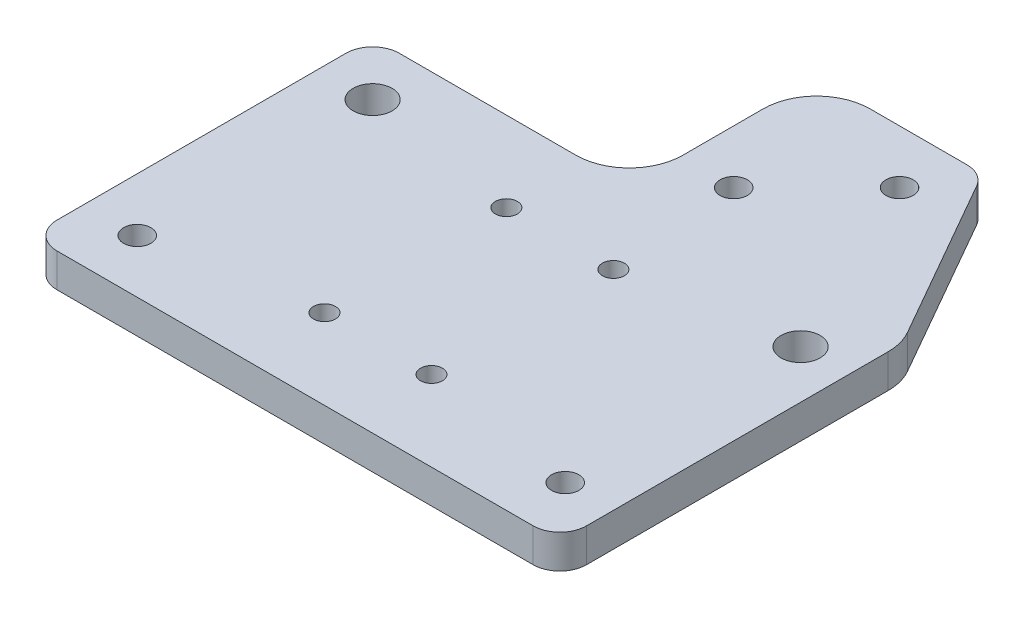
ISO-10303-21;
HEADER;
FILE_DESCRIPTION(('STEP AP214'),'2;1');
FILE_NAME('part.step','',(''),(''),'','','');
FILE_SCHEMA(('AUTOMOTIVE_DESIGN { 1 0 10303 214 1 1 1 1 }'));
ENDSEC;
DATA;
#1=APPLICATION_CONTEXT('core data for automotive mechanical design processes');
#2=APPLICATION_PROTOCOL_DEFINITION('international standard','automotive_design',2000,#1);
#3=PRODUCT_CONTEXT('',#1,'mechanical');
#4=PRODUCT('Part','Part','',(#3));
#5=PRODUCT_RELATED_PRODUCT_CATEGORY('part','',(#4));
#6=PRODUCT_DEFINITION_FORMATION('','',#4);
#7=PRODUCT_DEFINITION_CONTEXT('part definition',#1,'design');
#8=PRODUCT_DEFINITION('design','',#6,#7);
#9=PRODUCT_DEFINITION_SHAPE('','',#8);
#10=(LENGTH_UNIT() NAMED_UNIT(*) SI_UNIT(.MILLI.,.METRE.));
#11=(NAMED_UNIT(*) PLANE_ANGLE_UNIT() SI_UNIT($,.RADIAN.));
#12=(NAMED_UNIT(*) SI_UNIT($,.STERADIAN.) SOLID_ANGLE_UNIT());
#13=UNCERTAINTY_MEASURE_WITH_UNIT(LENGTH_MEASURE(1.E-05),#10,'distance_accuracy_value','');
#14=(GEOMETRIC_REPRESENTATION_CONTEXT(3) GLOBAL_UNCERTAINTY_ASSIGNED_CONTEXT((#13)) GLOBAL_UNIT_ASSIGNED_CONTEXT((#10,
#11,#12)) REPRESENTATION_CONTEXT('',''));
#15=CARTESIAN_POINT('',(0.,0.,0.));
#16=DIRECTION('',(0.,0.,1.));
#17=DIRECTION('',(1.,0.,0.));
#18=AXIS2_PLACEMENT_3D('',#15,#16,#17);
#19=CARTESIAN_POINT('',(0.,6.3,0.));
#20=DIRECTION('',(0.,0.,-1.));
#21=DIRECTION('',(-1.,0.,0.));
#22=AXIS2_PLACEMENT_3D('',#19,#20,#21);
#23=PLANE('',#22);
#24=DIRECTION('',(1.,0.,0.));
#25=VECTOR('',#24,1.);
#26=CARTESIAN_POINT('',(0.,6.3,0.));
#27=LINE('',#26,#25);
#28=CARTESIAN_POINT('',(5.,6.3,0.));
#29=VERTEX_POINT('',#28);
#30=CARTESIAN_POINT('',(94.,6.3,0.));
#31=VERTEX_POINT('',#30);
#32=EDGE_CURVE('E157',#29,#31,#27,.T.);
#33=ORIENTED_EDGE('',*,*,#32,.F.);
#34=DIRECTION('',(0.,-1.,0.));
#35=VECTOR('',#34,1.);
#36=CARTESIAN_POINT('',(5.,0.,0.));
#37=LINE('',#36,#35);
#38=CARTESIAN_POINT('',(5.,0.,0.));
#39=VERTEX_POINT('',#38);
#40=EDGE_CURVE('E181',#29,#39,#37,.T.);
#41=ORIENTED_EDGE('',*,*,#40,.T.);
#42=DIRECTION('',(1.,0.,0.));
#43=VECTOR('',#42,1.);
#44=CARTESIAN_POINT('',(0.,0.,0.));
#45=LINE('',#44,#43);
#46=CARTESIAN_POINT('',(94.,0.,0.));
#47=VERTEX_POINT('',#46);
#48=EDGE_CURVE('E141',#39,#47,#45,.T.);
#49=ORIENTED_EDGE('',*,*,#48,.T.);
#50=DIRECTION('',(0.,-1.,0.));
#51=VECTOR('',#50,1.);
#52=CARTESIAN_POINT('',(94.,6.3,0.));
#53=LINE('',#52,#51);
#54=EDGE_CURVE('E179',#47,#31,#53,.F.);
#55=ORIENTED_EDGE('',*,*,#54,.T.);
#56=EDGE_LOOP('',(#33,#41,#49,#55));
#57=FACE_BOUND('',#56,.T.);
#58=ADVANCED_FACE('F37',(#57),#23,.F.);
#59=CARTESIAN_POINT('',(99.,6.3,0.));
#60=DIRECTION('',(-1.,0.,0.));
#61=DIRECTION('',(0.,0.,1.));
#62=AXIS2_PLACEMENT_3D('',#59,#60,#61);
#63=PLANE('',#62);
#64=DIRECTION('',(0.,0.,-1.));
#65=VECTOR('',#64,1.);
#66=CARTESIAN_POINT('',(99.,0.,0.));
#67=LINE('',#66,#65);
#68=CARTESIAN_POINT('',(99.,0.,-5.));
#69=VERTEX_POINT('',#68);
#70=CARTESIAN_POINT('',(99.,0.,-61.3443556292536));
#71=VERTEX_POINT('',#70);
#72=EDGE_CURVE('E236',#69,#71,#67,.T.);
#73=ORIENTED_EDGE('',*,*,#72,.T.);
#74=DIRECTION('',(0.,-1.,0.));
#75=VECTOR('',#74,1.);
#76=CARTESIAN_POINT('',(99.,6.3,-61.3443556292536));
#77=LINE('',#76,#75);
#78=CARTESIAN_POINT('',(99.,6.3,-61.3443556292536));
#79=VERTEX_POINT('',#78);
#80=EDGE_CURVE('E213',#71,#79,#77,.F.);
#81=ORIENTED_EDGE('',*,*,#80,.T.);
#82=DIRECTION('',(0.,0.,-1.));
#83=VECTOR('',#82,1.);
#84=CARTESIAN_POINT('',(99.,6.3,0.));
#85=LINE('',#84,#83);
#86=CARTESIAN_POINT('',(99.,6.3,-5.));
#87=VERTEX_POINT('',#86);
#88=EDGE_CURVE('E248',#87,#79,#85,.T.);
#89=ORIENTED_EDGE('',*,*,#88,.F.);
#90=DIRECTION('',(0.,-1.,0.));
#91=VECTOR('',#90,1.);
#92=CARTESIAN_POINT('',(99.,6.3,-5.));
#93=LINE('',#92,#91);
#94=EDGE_CURVE('E183',#87,#69,#93,.T.);
#95=ORIENTED_EDGE('',*,*,#94,.T.);
#96=EDGE_LOOP('',(#73,#81,#89,#95));
#97=FACE_BOUND('',#96,.T.);
#98=ADVANCED_FACE('F372',(#97),#63,.F.);
#99=CARTESIAN_POINT('',(99.,6.3,-64.));
#100=DIRECTION('',(-0.868243142124459,0.,0.496138938356834));
#101=DIRECTION('',(0.496138938356834,0.,0.868243142124459));
#102=AXIS2_PLACEMENT_3D('',#99,#100,#101);
#103=PLANE('',#102);
#104=DIRECTION('',(-0.496138938356834,0.,-0.868243142124459));
#105=VECTOR('',#104,1.);
#106=CARTESIAN_POINT('',(99.,6.3,-64.));
#107=LINE('',#106,#105);
#108=CARTESIAN_POINT('',(97.6824314212446,6.3,-66.3057450128219));
#109=VERTEX_POINT('',#108);
#110=CARTESIAN_POINT('',(80.4396030332662,6.3,-96.4806946917842));
#111=VERTEX_POINT('',#110);
#112=EDGE_CURVE('E246',#109,#111,#107,.T.);
#113=ORIENTED_EDGE('',*,*,#112,.F.);
#114=DIRECTION('',(0.,-1.,0.));
#115=VECTOR('',#114,1.);
#116=CARTESIAN_POINT('',(97.6824314212446,6.3,-66.3057450128219));
#117=LINE('',#116,#115);
#118=CARTESIAN_POINT('',(97.6824314212446,0.,-66.3057450128219));
#119=VERTEX_POINT('',#118);
#120=EDGE_CURVE('E208',#109,#119,#117,.T.);
#121=ORIENTED_EDGE('',*,*,#120,.T.);
#122=DIRECTION('',(-0.496138938356834,0.,-0.868243142124459));
#123=VECTOR('',#122,1.);
#124=CARTESIAN_POINT('',(99.,0.,-64.));
#125=LINE('',#124,#123);
#126=CARTESIAN_POINT('',(80.4396030332662,0.,-96.4806946917842));
#127=VERTEX_POINT('',#126);
#128=EDGE_CURVE('E234',#119,#127,#125,.T.);
#129=ORIENTED_EDGE('',*,*,#128,.T.);
#130=DIRECTION('',(0.,-1.,0.));
#131=VECTOR('',#130,1.);
#132=CARTESIAN_POINT('',(80.4396030332662,6.3,-96.4806946917842));
#133=LINE('',#132,#131);
#134=EDGE_CURVE('E192',#127,#111,#133,.F.);
#135=ORIENTED_EDGE('',*,*,#134,.T.);
#136=EDGE_LOOP('',(#113,#121,#129,#135));
#137=FACE_BOUND('',#136,.T.);
#138=ADVANCED_FACE('F349',(#137),#103,.F.);
#139=CARTESIAN_POINT('',(48.,6.3,-99.));
#140=DIRECTION('',(0.,0.,-1.));
#141=DIRECTION('',(-1.,0.,0.));
#142=AXIS2_PLACEMENT_3D('',#139,#140,#141);
#143=PLANE('',#142);
#144=DIRECTION('',(1.,0.,0.));
#145=VECTOR('',#144,1.);
#146=CARTESIAN_POINT('',(48.,0.,-99.));
#147=LINE('',#146,#145);
#148=CARTESIAN_POINT('',(58.,0.,-99.));
#149=VERTEX_POINT('',#148);
#150=CARTESIAN_POINT('',(76.0983873226439,0.,-99.));
#151=VERTEX_POINT('',#150);
#152=EDGE_CURVE('E230',#149,#151,#147,.T.);
#153=ORIENTED_EDGE('',*,*,#152,.F.);
#154=DIRECTION('',(0.,-1.,0.));
#155=VECTOR('',#154,1.);
#156=CARTESIAN_POINT('',(58.,6.3,-99.));
#157=LINE('',#156,#155);
#158=CARTESIAN_POINT('',(58.,6.3,-99.));
#159=VERTEX_POINT('',#158);
#160=EDGE_CURVE('E203',#149,#159,#157,.F.);
#161=ORIENTED_EDGE('',*,*,#160,.T.);
#162=DIRECTION('',(1.,0.,0.));
#163=VECTOR('',#162,1.);
#164=CARTESIAN_POINT('',(48.,6.3,-99.));
#165=LINE('',#164,#163);
#166=CARTESIAN_POINT('',(76.0983873226439,6.3,-99.));
#167=VERTEX_POINT('',#166);
#168=EDGE_CURVE('E244',#159,#167,#165,.T.);
#169=ORIENTED_EDGE('',*,*,#168,.T.);
#170=DIRECTION('',(0.,-1.,0.));
#171=VECTOR('',#170,1.);
#172=CARTESIAN_POINT('',(76.0983873226439,0.,-99.));
#173=LINE('',#172,#171);
#174=EDGE_CURVE('E186',#167,#151,#173,.T.);
#175=ORIENTED_EDGE('',*,*,#174,.T.);
#176=EDGE_LOOP('',(#153,#161,#169,#175));
#177=FACE_BOUND('',#176,.T.);
#178=ADVANCED_FACE('F419',(#177),#143,.T.);
#179=CARTESIAN_POINT('',(48.,6.3,-64.));
#180=DIRECTION('',(-1.,0.,0.));
#181=DIRECTION('',(0.,0.,1.));
#182=AXIS2_PLACEMENT_3D('',#179,#180,#181);
#183=PLANE('',#182);
#184=DIRECTION('',(0.,0.,-1.));
#185=VECTOR('',#184,1.);
#186=CARTESIAN_POINT('',(48.,0.,-64.));
#187=LINE('',#186,#185);
#188=CARTESIAN_POINT('',(48.,0.,-74.));
#189=VERTEX_POINT('',#188);
#190=CARTESIAN_POINT('',(48.,0.,-89.));
#191=VERTEX_POINT('',#190);
#192=EDGE_CURVE('E229',#189,#191,#187,.T.);
#193=ORIENTED_EDGE('',*,*,#192,.F.);
#194=DIRECTION('',(0.,-1.,0.));
#195=VECTOR('',#194,1.);
#196=CARTESIAN_POINT('',(48.,6.3,-74.));
#197=LINE('',#196,#195);
#198=CARTESIAN_POINT('',(48.,6.3,-74.));
#199=VERTEX_POINT('',#198);
#200=EDGE_CURVE('E58',#189,#199,#197,.F.);
#201=ORIENTED_EDGE('',*,*,#200,.T.);
#202=DIRECTION('',(0.,0.,-1.));
#203=VECTOR('',#202,1.);
#204=CARTESIAN_POINT('',(48.,6.3,-64.));
#205=LINE('',#204,#203);
#206=CARTESIAN_POINT('',(48.,6.3,-89.));
#207=VERTEX_POINT('',#206);
#208=EDGE_CURVE('E242',#199,#207,#205,.T.);
#209=ORIENTED_EDGE('',*,*,#208,.T.);
#210=DIRECTION('',(0.,-1.,0.));
#211=VECTOR('',#210,1.);
#212=CARTESIAN_POINT('',(48.,6.3,-89.));
#213=LINE('',#212,#211);
#214=EDGE_CURVE('E198',#207,#191,#213,.T.);
#215=ORIENTED_EDGE('',*,*,#214,.T.);
#216=EDGE_LOOP('',(#193,#201,#209,#215));
#217=FACE_BOUND('',#216,.T.);
#218=ADVANCED_FACE('F366',(#217),#183,.T.);
#219=CARTESIAN_POINT('',(0.,6.3,-64.));
#220=DIRECTION('',(0.,0.,-1.));
#221=DIRECTION('',(-1.,0.,0.));
#222=AXIS2_PLACEMENT_3D('',#219,#220,#221);
#223=PLANE('',#222);
#224=DIRECTION('',(1.,0.,0.));
#225=VECTOR('',#224,1.);
#226=CARTESIAN_POINT('',(0.,6.3,-64.));
#227=LINE('',#226,#225);
#228=CARTESIAN_POINT('',(5.,6.3,-64.));
#229=VERTEX_POINT('',#228);
#230=CARTESIAN_POINT('',(38.,6.3,-64.));
#231=VERTEX_POINT('',#230);
#232=EDGE_CURVE('E166',#229,#231,#227,.T.);
#233=ORIENTED_EDGE('',*,*,#232,.T.);
#234=DIRECTION('',(0.,-1.,0.));
#235=VECTOR('',#234,1.);
#236=CARTESIAN_POINT('',(38.,0.,-64.));
#237=LINE('',#236,#235);
#238=CARTESIAN_POINT('',(38.,0.,-64.));
#239=VERTEX_POINT('',#238);
#240=EDGE_CURVE('E217',#231,#239,#237,.T.);
#241=ORIENTED_EDGE('',*,*,#240,.T.);
#242=DIRECTION('',(1.,0.,0.));
#243=VECTOR('',#242,1.);
#244=CARTESIAN_POINT('',(0.,0.,-64.));
#245=LINE('',#244,#243);
#246=CARTESIAN_POINT('',(5.,0.,-64.));
#247=VERTEX_POINT('',#246);
#248=EDGE_CURVE('E158',#247,#239,#245,.T.);
#249=ORIENTED_EDGE('',*,*,#248,.F.);
#250=DIRECTION('',(0.,-1.,0.));
#251=VECTOR('',#250,1.);
#252=CARTESIAN_POINT('',(5.,6.3,-64.));
#253=LINE('',#252,#251);
#254=EDGE_CURVE('E172',#247,#229,#253,.F.);
#255=ORIENTED_EDGE('',*,*,#254,.T.);
#256=EDGE_LOOP('',(#233,#241,#249,#255));
#257=FACE_BOUND('',#256,.T.);
#258=ADVANCED_FACE('F224',(#257),#223,.T.);
#259=CARTESIAN_POINT('',(0.,6.3,0.));
#260=DIRECTION('',(-1.,0.,0.));
#261=DIRECTION('',(0.,0.,1.));
#262=AXIS2_PLACEMENT_3D('',#259,#260,#261);
#263=PLANE('',#262);
#264=DIRECTION('',(0.,0.,-1.));
#265=VECTOR('',#264,1.);
#266=CARTESIAN_POINT('',(0.,6.3,0.));
#267=LINE('',#266,#265);
#268=CARTESIAN_POINT('',(0.,6.3,-5.));
#269=VERTEX_POINT('',#268);
#270=CARTESIAN_POINT('',(0.,6.3,-59.));
#271=VERTEX_POINT('',#270);
#272=EDGE_CURVE('E163',#269,#271,#267,.T.);
#273=ORIENTED_EDGE('',*,*,#272,.T.);
#274=DIRECTION('',(0.,-1.,0.));
#275=VECTOR('',#274,1.);
#276=CARTESIAN_POINT('',(0.,6.3,-59.));
#277=LINE('',#276,#275);
#278=CARTESIAN_POINT('',(0.,0.,-59.));
#279=VERTEX_POINT('',#278);
#280=EDGE_CURVE('E156',#271,#279,#277,.T.);
#281=ORIENTED_EDGE('',*,*,#280,.T.);
#282=DIRECTION('',(0.,0.,-1.));
#283=VECTOR('',#282,1.);
#284=CARTESIAN_POINT('',(0.,0.,0.));
#285=LINE('',#284,#283);
#286=CARTESIAN_POINT('',(0.,0.,-5.));
#287=VERTEX_POINT('',#286);
#288=EDGE_CURVE('E139',#287,#279,#285,.T.);
#289=ORIENTED_EDGE('',*,*,#288,.F.);
#290=DIRECTION('',(0.,-1.,0.));
#291=VECTOR('',#290,1.);
#292=CARTESIAN_POINT('',(0.,6.3,-5.));
#293=LINE('',#292,#291);
#294=EDGE_CURVE('E153',#287,#269,#293,.F.);
#295=ORIENTED_EDGE('',*,*,#294,.T.);
#296=EDGE_LOOP('',(#273,#281,#289,#295));
#297=FACE_BOUND('',#296,.T.);
#298=ADVANCED_FACE('F152',(#297),#263,.T.);
#299=CARTESIAN_POINT('',(0.,6.3,0.));
#300=DIRECTION('',(0.,1.,0.));
#301=DIRECTION('',(0.,0.,1.));
#302=AXIS2_PLACEMENT_3D('',#299,#300,#301);
#303=PLANE('',#302);
#304=CARTESIAN_POINT('',(10.,6.3,-10.));
#305=DIRECTION('',(0.,1.,0.));
#306=DIRECTION('',(0.,0.,1.));
#307=AXIS2_PLACEMENT_3D('',#304,#305,#306);
#308=CIRCLE('',#307,2.55);
#309=CARTESIAN_POINT('',(10.,6.3,-7.45));
#310=VERTEX_POINT('',#309);
#311=EDGE_CURVE('E304',#310,#310,#308,.T.);
#312=ORIENTED_EDGE('',*,*,#311,.F.);
#313=EDGE_LOOP('',(#312));
#314=FACE_BOUND('',#313,.T.);
#315=CARTESIAN_POINT('',(40.,6.3,-15.));
#316=DIRECTION('',(0.,1.,0.));
#317=DIRECTION('',(0.,0.,1.));
#318=AXIS2_PLACEMENT_3D('',#315,#316,#317);
#319=CIRCLE('',#318,2.05);
#320=CARTESIAN_POINT('',(40.,6.3,-12.95));
#321=VERTEX_POINT('',#320);
#322=EDGE_CURVE('E298',#321,#321,#319,.T.);
#323=ORIENTED_EDGE('',*,*,#322,.F.);
#324=EDGE_LOOP('',(#323));
#325=FACE_BOUND('',#324,.T.);
#326=CARTESIAN_POINT('',(60.,6.3,-15.));
#327=DIRECTION('',(0.,1.,0.));
#328=DIRECTION('',(0.,0.,1.));
#329=AXIS2_PLACEMENT_3D('',#326,#327,#328);
#330=CIRCLE('',#329,2.04999999999999);
#331=CARTESIAN_POINT('',(60.,6.3,-12.95));
#332=VERTEX_POINT('',#331);
#333=EDGE_CURVE('E292',#332,#332,#330,.T.);
#334=ORIENTED_EDGE('',*,*,#333,.F.);
#335=EDGE_LOOP('',(#334));
#336=FACE_BOUND('',#335,.T.);
#337=CARTESIAN_POINT('',(90.,6.3,-10.));
#338=DIRECTION('',(0.,1.,0.));
#339=DIRECTION('',(0.,0.,1.));
#340=AXIS2_PLACEMENT_3D('',#337,#338,#339);
#341=CIRCLE('',#340,2.54999999999999);
#342=CARTESIAN_POINT('',(90.,6.3,-7.45000000000001));
#343=VERTEX_POINT('',#342);
#344=EDGE_CURVE('E286',#343,#343,#341,.T.);
#345=ORIENTED_EDGE('',*,*,#344,.F.);
#346=EDGE_LOOP('',(#345));
#347=FACE_BOUND('',#346,.T.);
#348=CARTESIAN_POINT('',(40.,6.3,-49.));
#349=DIRECTION('',(0.,1.,0.));
#350=DIRECTION('',(0.,0.,1.));
#351=AXIS2_PLACEMENT_3D('',#348,#349,#350);
#352=CIRCLE('',#351,2.05);
#353=CARTESIAN_POINT('',(40.,6.3,-46.95));
#354=VERTEX_POINT('',#353);
#355=EDGE_CURVE('E280',#354,#354,#352,.T.);
#356=ORIENTED_EDGE('',*,*,#355,.F.);
#357=EDGE_LOOP('',(#356));
#358=FACE_BOUND('',#357,.T.);
#359=CARTESIAN_POINT('',(60.,6.3,-49.));
#360=DIRECTION('',(0.,1.,0.));
#361=DIRECTION('',(0.,0.,1.));
#362=AXIS2_PLACEMENT_3D('',#359,#360,#361);
#363=CIRCLE('',#362,2.05);
#364=CARTESIAN_POINT('',(60.,6.3,-46.95));
#365=VERTEX_POINT('',#364);
#366=EDGE_CURVE('E274',#365,#365,#363,.T.);
#367=ORIENTED_EDGE('',*,*,#366,.F.);
#368=EDGE_LOOP('',(#367));
#369=FACE_BOUND('',#368,.T.);
#370=CARTESIAN_POINT('',(10.,6.3,-54.));
#371=DIRECTION('',(0.,1.,0.));
#372=DIRECTION('',(0.,0.,1.));
#373=AXIS2_PLACEMENT_3D('',#370,#371,#372);
#374=CIRCLE('',#373,3.65);
#375=CARTESIAN_POINT('',(10.,6.3,-50.35));
#376=VERTEX_POINT('',#375);
#377=EDGE_CURVE('E268',#376,#376,#374,.T.);
#378=ORIENTED_EDGE('',*,*,#377,.F.);
#379=EDGE_LOOP('',(#378));
#380=FACE_BOUND('',#379,.T.);
#381=CARTESIAN_POINT('',(58.,6.3,-73.5));
#382=DIRECTION('',(0.,1.,0.));
#383=DIRECTION('',(0.,0.,1.));
#384=AXIS2_PLACEMENT_3D('',#381,#382,#383);
#385=CIRCLE('',#384,2.54999999999999);
#386=CARTESIAN_POINT('',(58.,6.3,-70.95));
#387=VERTEX_POINT('',#386);
#388=EDGE_CURVE('E262',#387,#387,#385,.T.);
#389=ORIENTED_EDGE('',*,*,#388,.F.);
#390=EDGE_LOOP('',(#389));
#391=FACE_BOUND('',#390,.T.);
#392=CARTESIAN_POINT('',(90.,6.3,-54.));
#393=DIRECTION('',(0.,1.,0.));
#394=DIRECTION('',(0.,0.,1.));
#395=AXIS2_PLACEMENT_3D('',#392,#393,#394);
#396=CIRCLE('',#395,3.65);
#397=CARTESIAN_POINT('',(90.,6.3,-50.35));
#398=VERTEX_POINT('',#397);
#399=EDGE_CURVE('E256',#398,#398,#396,.T.);
#400=ORIENTED_EDGE('',*,*,#399,.F.);
#401=EDGE_LOOP('',(#400));
#402=FACE_BOUND('',#401,.T.);
#403=CARTESIAN_POINT('',(73.5,6.3,-89.));
#404=DIRECTION('',(0.,1.,0.));
#405=DIRECTION('',(0.,0.,1.));
#406=AXIS2_PLACEMENT_3D('',#403,#404,#405);
#407=CIRCLE('',#406,2.54999999999999);
#408=CARTESIAN_POINT('',(73.5,6.3,-86.45));
#409=VERTEX_POINT('',#408);
#410=EDGE_CURVE('E239',#409,#409,#407,.T.);
#411=ORIENTED_EDGE('',*,*,#410,.F.);
#412=EDGE_LOOP('',(#411));
#413=FACE_BOUND('',#412,.T.);
#414=ORIENTED_EDGE('',*,*,#88,.T.);
#415=CARTESIAN_POINT('',(89.,6.3,-61.3443556292536));
#416=DIRECTION('',(0.,1.,0.));
#417=DIRECTION('',(0.,0.,1.));
#418=AXIS2_PLACEMENT_3D('',#415,#416,#417);
#419=CIRCLE('',#418,10.);
#420=EDGE_CURVE('E215',#79,#109,#419,.T.);
#421=ORIENTED_EDGE('',*,*,#420,.T.);
#422=ORIENTED_EDGE('',*,*,#112,.T.);
#423=CARTESIAN_POINT('',(76.0983873226439,6.3,-94.));
#424=DIRECTION('',(0.,1.,0.));
#425=DIRECTION('',(0.,0.,1.));
#426=AXIS2_PLACEMENT_3D('',#423,#424,#425);
#427=CIRCLE('',#426,5.);
#428=EDGE_CURVE('E195',#111,#167,#427,.T.);
#429=ORIENTED_EDGE('',*,*,#428,.T.);
#430=ORIENTED_EDGE('',*,*,#168,.F.);
#431=CARTESIAN_POINT('',(58.,6.3,-89.));
#432=DIRECTION('',(0.,1.,0.));
#433=DIRECTION('',(0.,0.,1.));
#434=AXIS2_PLACEMENT_3D('',#431,#432,#433);
#435=CIRCLE('',#434,10.);
#436=EDGE_CURVE('E205',#159,#207,#435,.T.);
#437=ORIENTED_EDGE('',*,*,#436,.T.);
#438=ORIENTED_EDGE('',*,*,#208,.F.);
#439=CARTESIAN_POINT('',(38.,6.3,-74.));
#440=DIRECTION('',(0.,1.,0.));
#441=DIRECTION('',(0.,0.,1.));
#442=AXIS2_PLACEMENT_3D('',#439,#440,#441);
#443=CIRCLE('',#442,10.);
#444=EDGE_CURVE('E11',#199,#231,#443,.F.);
#445=ORIENTED_EDGE('',*,*,#444,.T.);
#446=ORIENTED_EDGE('',*,*,#232,.F.);
#447=CARTESIAN_POINT('',(5.,6.3,-59.));
#448=DIRECTION('',(0.,1.,0.));
#449=DIRECTION('',(0.,0.,1.));
#450=AXIS2_PLACEMENT_3D('',#447,#448,#449);
#451=CIRCLE('',#450,5.);
#452=EDGE_CURVE('E177',#229,#271,#451,.T.);
#453=ORIENTED_EDGE('',*,*,#452,.T.);
#454=ORIENTED_EDGE('',*,*,#272,.F.);
#455=CARTESIAN_POINT('',(5.,6.3,-5.));
#456=DIRECTION('',(0.,1.,0.));
#457=DIRECTION('',(0.,0.,1.));
#458=AXIS2_PLACEMENT_3D('',#455,#456,#457);
#459=CIRCLE('',#458,5.);
#460=EDGE_CURVE('E162',#269,#29,#459,.T.);
#461=ORIENTED_EDGE('',*,*,#460,.T.);
#462=ORIENTED_EDGE('',*,*,#32,.T.);
#463=CARTESIAN_POINT('',(94.,6.3,-5.));
#464=DIRECTION('',(0.,1.,0.));
#465=DIRECTION('',(0.,0.,1.));
#466=AXIS2_PLACEMENT_3D('',#463,#464,#465);
#467=CIRCLE('',#466,5.);
#468=EDGE_CURVE('E174',#31,#87,#467,.T.);
#469=ORIENTED_EDGE('',*,*,#468,.T.);
#470=EDGE_LOOP('',(#414,#421,#422,#429,#430,#437,#438,#445,#446,#453,#454,#461,#462,#469));
#471=FACE_BOUND('',#470,.T.);
#472=ADVANCED_FACE('F316',(#314,#325,#336,#347,#358,#369,#380,#391,#402,#413,#471),#303,.T.);
#473=CARTESIAN_POINT('',(0.,0.,0.));
#474=DIRECTION('',(0.,1.,0.));
#475=DIRECTION('',(0.,0.,1.));
#476=AXIS2_PLACEMENT_3D('',#473,#474,#475);
#477=PLANE('',#476);
#478=CARTESIAN_POINT('',(10.,0.,-10.));
#479=DIRECTION('',(0.,1.,0.));
#480=DIRECTION('',(0.,0.,1.));
#481=AXIS2_PLACEMENT_3D('',#478,#479,#480);
#482=CIRCLE('',#481,2.55);
#483=CARTESIAN_POINT('',(10.,0.,-7.45));
#484=VERTEX_POINT('',#483);
#485=EDGE_CURVE('E307',#484,#484,#482,.T.);
#486=ORIENTED_EDGE('',*,*,#485,.T.);
#487=EDGE_LOOP('',(#486));
#488=FACE_BOUND('',#487,.T.);
#489=CARTESIAN_POINT('',(40.,0.,-15.));
#490=DIRECTION('',(0.,1.,0.));
#491=DIRECTION('',(0.,0.,1.));
#492=AXIS2_PLACEMENT_3D('',#489,#490,#491);
#493=CIRCLE('',#492,2.05);
#494=CARTESIAN_POINT('',(40.,0.,-12.95));
#495=VERTEX_POINT('',#494);
#496=EDGE_CURVE('E301',#495,#495,#493,.T.);
#497=ORIENTED_EDGE('',*,*,#496,.T.);
#498=EDGE_LOOP('',(#497));
#499=FACE_BOUND('',#498,.T.);
#500=CARTESIAN_POINT('',(60.,0.,-15.));
#501=DIRECTION('',(0.,1.,0.));
#502=DIRECTION('',(0.,0.,1.));
#503=AXIS2_PLACEMENT_3D('',#500,#501,#502);
#504=CIRCLE('',#503,2.04999999999999);
#505=CARTESIAN_POINT('',(60.,0.,-12.95));
#506=VERTEX_POINT('',#505);
#507=EDGE_CURVE('E295',#506,#506,#504,.T.);
#508=ORIENTED_EDGE('',*,*,#507,.T.);
#509=EDGE_LOOP('',(#508));
#510=FACE_BOUND('',#509,.T.);
#511=CARTESIAN_POINT('',(90.,0.,-10.));
#512=DIRECTION('',(0.,1.,0.));
#513=DIRECTION('',(0.,0.,1.));
#514=AXIS2_PLACEMENT_3D('',#511,#512,#513);
#515=CIRCLE('',#514,2.54999999999999);
#516=CARTESIAN_POINT('',(90.,0.,-7.45000000000001));
#517=VERTEX_POINT('',#516);
#518=EDGE_CURVE('E289',#517,#517,#515,.T.);
#519=ORIENTED_EDGE('',*,*,#518,.T.);
#520=EDGE_LOOP('',(#519));
#521=FACE_BOUND('',#520,.T.);
#522=CARTESIAN_POINT('',(40.,0.,-49.));
#523=DIRECTION('',(0.,1.,0.));
#524=DIRECTION('',(0.,0.,1.));
#525=AXIS2_PLACEMENT_3D('',#522,#523,#524);
#526=CIRCLE('',#525,2.05);
#527=CARTESIAN_POINT('',(40.,0.,-46.95));
#528=VERTEX_POINT('',#527);
#529=EDGE_CURVE('E283',#528,#528,#526,.T.);
#530=ORIENTED_EDGE('',*,*,#529,.T.);
#531=EDGE_LOOP('',(#530));
#532=FACE_BOUND('',#531,.T.);
#533=CARTESIAN_POINT('',(60.,0.,-49.));
#534=DIRECTION('',(0.,1.,0.));
#535=DIRECTION('',(0.,0.,1.));
#536=AXIS2_PLACEMENT_3D('',#533,#534,#535);
#537=CIRCLE('',#536,2.05);
#538=CARTESIAN_POINT('',(60.,0.,-46.95));
#539=VERTEX_POINT('',#538);
#540=EDGE_CURVE('E277',#539,#539,#537,.T.);
#541=ORIENTED_EDGE('',*,*,#540,.T.);
#542=EDGE_LOOP('',(#541));
#543=FACE_BOUND('',#542,.T.);
#544=CARTESIAN_POINT('',(10.,0.,-54.));
#545=DIRECTION('',(0.,1.,0.));
#546=DIRECTION('',(0.,0.,1.));
#547=AXIS2_PLACEMENT_3D('',#544,#545,#546);
#548=CIRCLE('',#547,3.65);
#549=CARTESIAN_POINT('',(10.,0.,-50.35));
#550=VERTEX_POINT('',#549);
#551=EDGE_CURVE('E271',#550,#550,#548,.T.);
#552=ORIENTED_EDGE('',*,*,#551,.T.);
#553=EDGE_LOOP('',(#552));
#554=FACE_BOUND('',#553,.T.);
#555=CARTESIAN_POINT('',(58.,0.,-73.5));
#556=DIRECTION('',(0.,1.,0.));
#557=DIRECTION('',(0.,0.,1.));
#558=AXIS2_PLACEMENT_3D('',#555,#556,#557);
#559=CIRCLE('',#558,2.54999999999999);
#560=CARTESIAN_POINT('',(58.,0.,-70.95));
#561=VERTEX_POINT('',#560);
#562=EDGE_CURVE('E265',#561,#561,#559,.T.);
#563=ORIENTED_EDGE('',*,*,#562,.T.);
#564=EDGE_LOOP('',(#563));
#565=FACE_BOUND('',#564,.T.);
#566=CARTESIAN_POINT('',(90.,0.,-54.));
#567=DIRECTION('',(0.,1.,0.));
#568=DIRECTION('',(0.,0.,1.));
#569=AXIS2_PLACEMENT_3D('',#566,#567,#568);
#570=CIRCLE('',#569,3.65);
#571=CARTESIAN_POINT('',(90.,0.,-50.35));
#572=VERTEX_POINT('',#571);
#573=EDGE_CURVE('E259',#572,#572,#570,.T.);
#574=ORIENTED_EDGE('',*,*,#573,.T.);
#575=EDGE_LOOP('',(#574));
#576=FACE_BOUND('',#575,.T.);
#577=CARTESIAN_POINT('',(73.5,0.,-89.));
#578=DIRECTION('',(0.,1.,0.));
#579=DIRECTION('',(0.,0.,1.));
#580=AXIS2_PLACEMENT_3D('',#577,#578,#579);
#581=CIRCLE('',#580,2.54999999999999);
#582=CARTESIAN_POINT('',(73.5,0.,-86.45));
#583=VERTEX_POINT('',#582);
#584=EDGE_CURVE('E253',#583,#583,#581,.T.);
#585=ORIENTED_EDGE('',*,*,#584,.T.);
#586=EDGE_LOOP('',(#585));
#587=FACE_BOUND('',#586,.T.);
#588=ORIENTED_EDGE('',*,*,#128,.F.);
#589=CARTESIAN_POINT('',(89.,0.,-61.3443556292536));
#590=DIRECTION('',(0.,1.,0.));
#591=DIRECTION('',(0.,0.,1.));
#592=AXIS2_PLACEMENT_3D('',#589,#590,#591);
#593=CIRCLE('',#592,10.);
#594=EDGE_CURVE('E211',#119,#71,#593,.F.);
#595=ORIENTED_EDGE('',*,*,#594,.T.);
#596=ORIENTED_EDGE('',*,*,#72,.F.);
#597=CARTESIAN_POINT('',(94.,0.,-5.));
#598=DIRECTION('',(0.,1.,0.));
#599=DIRECTION('',(0.,0.,1.));
#600=AXIS2_PLACEMENT_3D('',#597,#598,#599);
#601=CIRCLE('',#600,5.);
#602=EDGE_CURVE('E147',#69,#47,#601,.F.);
#603=ORIENTED_EDGE('',*,*,#602,.T.);
#604=ORIENTED_EDGE('',*,*,#48,.F.);
#605=CARTESIAN_POINT('',(5.,0.,-5.));
#606=DIRECTION('',(0.,1.,0.));
#607=DIRECTION('',(0.,0.,1.));
#608=AXIS2_PLACEMENT_3D('',#605,#606,#607);
#609=CIRCLE('',#608,5.);
#610=EDGE_CURVE('E135',#39,#287,#609,.F.);
#611=ORIENTED_EDGE('',*,*,#610,.T.);
#612=ORIENTED_EDGE('',*,*,#288,.T.);
#613=CARTESIAN_POINT('',(5.,0.,-59.));
#614=DIRECTION('',(0.,1.,0.));
#615=DIRECTION('',(0.,0.,1.));
#616=AXIS2_PLACEMENT_3D('',#613,#614,#615);
#617=CIRCLE('',#616,5.);
#618=EDGE_CURVE('E146',#279,#247,#617,.F.);
#619=ORIENTED_EDGE('',*,*,#618,.T.);
#620=ORIENTED_EDGE('',*,*,#248,.T.);
#621=CARTESIAN_POINT('',(38.,0.,-74.));
#622=DIRECTION('',(0.,1.,0.));
#623=DIRECTION('',(0.,0.,1.));
#624=AXIS2_PLACEMENT_3D('',#621,#622,#623);
#625=CIRCLE('',#624,10.);
#626=EDGE_CURVE('E45',#239,#189,#625,.T.);
#627=ORIENTED_EDGE('',*,*,#626,.T.);
#628=ORIENTED_EDGE('',*,*,#192,.T.);
#629=CARTESIAN_POINT('',(58.,0.,-89.));
#630=DIRECTION('',(0.,1.,0.));
#631=DIRECTION('',(0.,0.,1.));
#632=AXIS2_PLACEMENT_3D('',#629,#630,#631);
#633=CIRCLE('',#632,10.);
#634=EDGE_CURVE('E201',#191,#149,#633,.F.);
#635=ORIENTED_EDGE('',*,*,#634,.T.);
#636=ORIENTED_EDGE('',*,*,#152,.T.);
#637=CARTESIAN_POINT('',(76.0983873226439,0.,-94.));
#638=DIRECTION('',(0.,1.,0.));
#639=DIRECTION('',(0.,0.,1.));
#640=AXIS2_PLACEMENT_3D('',#637,#638,#639);
#641=CIRCLE('',#640,5.);
#642=EDGE_CURVE('E189',#151,#127,#641,.F.);
#643=ORIENTED_EDGE('',*,*,#642,.T.);
#644=EDGE_LOOP('',(#588,#595,#596,#603,#604,#611,#612,#619,#620,#627,#628,#635,#636,#643));
#645=FACE_BOUND('',#644,.T.);
#646=ADVANCED_FACE('F138',(#488,#499,#510,#521,#532,#543,#554,#565,#576,#587,#645),#477,.F.);
#647=CARTESIAN_POINT('',(73.5,6.3,-89.));
#648=DIRECTION('',(0.,-1.,0.));
#649=DIRECTION('',(0.,0.,-1.));
#650=AXIS2_PLACEMENT_3D('',#647,#648,#649);
#651=CYLINDRICAL_SURFACE('',#650,2.54999999999999);
#652=ORIENTED_EDGE('',*,*,#410,.T.);
#653=EDGE_LOOP('',(#652));
#654=FACE_BOUND('',#653,.T.);
#655=ORIENTED_EDGE('',*,*,#584,.F.);
#656=EDGE_LOOP('',(#655));
#657=FACE_BOUND('',#656,.T.);
#658=ADVANCED_FACE('F445',(#654,#657),#651,.F.);
#659=CARTESIAN_POINT('',(90.,6.3,-54.));
#660=DIRECTION('',(0.,-1.,0.));
#661=DIRECTION('',(0.,0.,-1.));
#662=AXIS2_PLACEMENT_3D('',#659,#660,#661);
#663=CYLINDRICAL_SURFACE('',#662,3.65);
#664=ORIENTED_EDGE('',*,*,#399,.T.);
#665=EDGE_LOOP('',(#664));
#666=FACE_BOUND('',#665,.T.);
#667=ORIENTED_EDGE('',*,*,#573,.F.);
#668=EDGE_LOOP('',(#667));
#669=FACE_BOUND('',#668,.T.);
#670=ADVANCED_FACE('F459',(#666,#669),#663,.F.);
#671=CARTESIAN_POINT('',(58.,6.3,-73.5));
#672=DIRECTION('',(0.,-1.,0.));
#673=DIRECTION('',(0.,0.,-1.));
#674=AXIS2_PLACEMENT_3D('',#671,#672,#673);
#675=CYLINDRICAL_SURFACE('',#674,2.54999999999999);
#676=ORIENTED_EDGE('',*,*,#388,.T.);
#677=EDGE_LOOP('',(#676));
#678=FACE_BOUND('',#677,.T.);
#679=ORIENTED_EDGE('',*,*,#562,.F.);
#680=EDGE_LOOP('',(#679));
#681=FACE_BOUND('',#680,.T.);
#682=ADVANCED_FACE('F466',(#678,#681),#675,.F.);
#683=CARTESIAN_POINT('',(10.,6.3,-54.));
#684=DIRECTION('',(0.,-1.,0.));
#685=DIRECTION('',(0.,0.,-1.));
#686=AXIS2_PLACEMENT_3D('',#683,#684,#685);
#687=CYLINDRICAL_SURFACE('',#686,3.65);
#688=ORIENTED_EDGE('',*,*,#377,.T.);
#689=EDGE_LOOP('',(#688));
#690=FACE_BOUND('',#689,.T.);
#691=ORIENTED_EDGE('',*,*,#551,.F.);
#692=EDGE_LOOP('',(#691));
#693=FACE_BOUND('',#692,.T.);
#694=ADVANCED_FACE('F474',(#690,#693),#687,.F.);
#695=CARTESIAN_POINT('',(60.,6.3,-49.));
#696=DIRECTION('',(0.,-1.,0.));
#697=DIRECTION('',(0.,0.,-1.));
#698=AXIS2_PLACEMENT_3D('',#695,#696,#697);
#699=CYLINDRICAL_SURFACE('',#698,2.05);
#700=ORIENTED_EDGE('',*,*,#366,.T.);
#701=EDGE_LOOP('',(#700));
#702=FACE_BOUND('',#701,.T.);
#703=ORIENTED_EDGE('',*,*,#540,.F.);
#704=EDGE_LOOP('',(#703));
#705=FACE_BOUND('',#704,.T.);
#706=ADVANCED_FACE('F482',(#702,#705),#699,.F.);
#707=CARTESIAN_POINT('',(40.,6.3,-49.));
#708=DIRECTION('',(0.,-1.,0.));
#709=DIRECTION('',(0.,0.,-1.));
#710=AXIS2_PLACEMENT_3D('',#707,#708,#709);
#711=CYLINDRICAL_SURFACE('',#710,2.05);
#712=ORIENTED_EDGE('',*,*,#355,.T.);
#713=EDGE_LOOP('',(#712));
#714=FACE_BOUND('',#713,.T.);
#715=ORIENTED_EDGE('',*,*,#529,.F.);
#716=EDGE_LOOP('',(#715));
#717=FACE_BOUND('',#716,.T.);
#718=ADVANCED_FACE('F490',(#714,#717),#711,.F.);
#719=CARTESIAN_POINT('',(90.,6.3,-10.));
#720=DIRECTION('',(0.,-1.,0.));
#721=DIRECTION('',(0.,0.,-1.));
#722=AXIS2_PLACEMENT_3D('',#719,#720,#721);
#723=CYLINDRICAL_SURFACE('',#722,2.54999999999999);
#724=ORIENTED_EDGE('',*,*,#344,.T.);
#725=EDGE_LOOP('',(#724));
#726=FACE_BOUND('',#725,.T.);
#727=ORIENTED_EDGE('',*,*,#518,.F.);
#728=EDGE_LOOP('',(#727));
#729=FACE_BOUND('',#728,.T.);
#730=ADVANCED_FACE('F498',(#726,#729),#723,.F.);
#731=CARTESIAN_POINT('',(60.,6.3,-15.));
#732=DIRECTION('',(0.,-1.,0.));
#733=DIRECTION('',(0.,0.,-1.));
#734=AXIS2_PLACEMENT_3D('',#731,#732,#733);
#735=CYLINDRICAL_SURFACE('',#734,2.04999999999999);
#736=ORIENTED_EDGE('',*,*,#333,.T.);
#737=EDGE_LOOP('',(#736));
#738=FACE_BOUND('',#737,.T.);
#739=ORIENTED_EDGE('',*,*,#507,.F.);
#740=EDGE_LOOP('',(#739));
#741=FACE_BOUND('',#740,.T.);
#742=ADVANCED_FACE('F506',(#738,#741),#735,.F.);
#743=CARTESIAN_POINT('',(40.,6.3,-15.));
#744=DIRECTION('',(0.,-1.,0.));
#745=DIRECTION('',(0.,0.,-1.));
#746=AXIS2_PLACEMENT_3D('',#743,#744,#745);
#747=CYLINDRICAL_SURFACE('',#746,2.05);
#748=ORIENTED_EDGE('',*,*,#322,.T.);
#749=EDGE_LOOP('',(#748));
#750=FACE_BOUND('',#749,.T.);
#751=ORIENTED_EDGE('',*,*,#496,.F.);
#752=EDGE_LOOP('',(#751));
#753=FACE_BOUND('',#752,.T.);
#754=ADVANCED_FACE('F514',(#750,#753),#747,.F.);
#755=CARTESIAN_POINT('',(10.,6.3,-10.));
#756=DIRECTION('',(0.,-1.,0.));
#757=DIRECTION('',(0.,0.,-1.));
#758=AXIS2_PLACEMENT_3D('',#755,#756,#757);
#759=CYLINDRICAL_SURFACE('',#758,2.55);
#760=ORIENTED_EDGE('',*,*,#311,.T.);
#761=EDGE_LOOP('',(#760));
#762=FACE_BOUND('',#761,.T.);
#763=ORIENTED_EDGE('',*,*,#485,.F.);
#764=EDGE_LOOP('',(#763));
#765=FACE_BOUND('',#764,.T.);
#766=ADVANCED_FACE('F313',(#762,#765),#759,.F.);
#767=CARTESIAN_POINT('',(5.,6.3,-59.));
#768=DIRECTION('',(0.,-1.,0.));
#769=DIRECTION('',(0.,0.,-1.));
#770=AXIS2_PLACEMENT_3D('',#767,#768,#769);
#771=CYLINDRICAL_SURFACE('',#770,5.);
#772=ORIENTED_EDGE('',*,*,#452,.F.);
#773=ORIENTED_EDGE('',*,*,#254,.F.);
#774=ORIENTED_EDGE('',*,*,#618,.F.);
#775=ORIENTED_EDGE('',*,*,#280,.F.);
#776=EDGE_LOOP('',(#772,#773,#774,#775));
#777=FACE_BOUND('',#776,.T.);
#778=ADVANCED_FACE('F382',(#777),#771,.T.);
#779=CARTESIAN_POINT('',(5.,6.3,-5.));
#780=DIRECTION('',(0.,1.,0.));
#781=DIRECTION('',(0.,0.,1.));
#782=AXIS2_PLACEMENT_3D('',#779,#780,#781);
#783=CYLINDRICAL_SURFACE('',#782,5.);
#784=ORIENTED_EDGE('',*,*,#460,.F.);
#785=ORIENTED_EDGE('',*,*,#294,.F.);
#786=ORIENTED_EDGE('',*,*,#610,.F.);
#787=ORIENTED_EDGE('',*,*,#40,.F.);
#788=EDGE_LOOP('',(#784,#785,#786,#787));
#789=FACE_BOUND('',#788,.T.);
#790=ADVANCED_FACE('F161',(#789),#783,.T.);
#791=CARTESIAN_POINT('',(94.,6.3,-5.));
#792=DIRECTION('',(0.,-1.,0.));
#793=DIRECTION('',(0.,0.,-1.));
#794=AXIS2_PLACEMENT_3D('',#791,#792,#793);
#795=CYLINDRICAL_SURFACE('',#794,5.);
#796=ORIENTED_EDGE('',*,*,#468,.F.);
#797=ORIENTED_EDGE('',*,*,#54,.F.);
#798=ORIENTED_EDGE('',*,*,#602,.F.);
#799=ORIENTED_EDGE('',*,*,#94,.F.);
#800=EDGE_LOOP('',(#796,#797,#798,#799));
#801=FACE_BOUND('',#800,.T.);
#802=ADVANCED_FACE('F388',(#801),#795,.T.);
#803=CARTESIAN_POINT('',(76.0983873226439,6.3,-94.));
#804=DIRECTION('',(0.,1.,0.));
#805=DIRECTION('',(0.,0.,1.));
#806=AXIS2_PLACEMENT_3D('',#803,#804,#805);
#807=CYLINDRICAL_SURFACE('',#806,5.);
#808=ORIENTED_EDGE('',*,*,#428,.F.);
#809=ORIENTED_EDGE('',*,*,#134,.F.);
#810=ORIENTED_EDGE('',*,*,#642,.F.);
#811=ORIENTED_EDGE('',*,*,#174,.F.);
#812=EDGE_LOOP('',(#808,#809,#810,#811));
#813=FACE_BOUND('',#812,.T.);
#814=ADVANCED_FACE('F357',(#813),#807,.T.);
#815=CARTESIAN_POINT('',(58.,6.3,-89.));
#816=DIRECTION('',(0.,-1.,0.));
#817=DIRECTION('',(0.,0.,-1.));
#818=AXIS2_PLACEMENT_3D('',#815,#816,#817);
#819=CYLINDRICAL_SURFACE('',#818,10.);
#820=ORIENTED_EDGE('',*,*,#436,.F.);
#821=ORIENTED_EDGE('',*,*,#160,.F.);
#822=ORIENTED_EDGE('',*,*,#634,.F.);
#823=ORIENTED_EDGE('',*,*,#214,.F.);
#824=EDGE_LOOP('',(#820,#821,#822,#823));
#825=FACE_BOUND('',#824,.T.);
#826=ADVANCED_FACE('F364',(#825),#819,.T.);
#827=CARTESIAN_POINT('',(89.,6.3,-61.3443556292536));
#828=DIRECTION('',(0.,-1.,0.));
#829=DIRECTION('',(0.,0.,-1.));
#830=AXIS2_PLACEMENT_3D('',#827,#828,#829);
#831=CYLINDRICAL_SURFACE('',#830,10.);
#832=ORIENTED_EDGE('',*,*,#420,.F.);
#833=ORIENTED_EDGE('',*,*,#80,.F.);
#834=ORIENTED_EDGE('',*,*,#594,.F.);
#835=ORIENTED_EDGE('',*,*,#120,.F.);
#836=EDGE_LOOP('',(#832,#833,#834,#835));
#837=FACE_BOUND('',#836,.T.);
#838=ADVANCED_FACE('F347',(#837),#831,.T.);
#839=CARTESIAN_POINT('',(38.,6.3,-74.));
#840=DIRECTION('',(0.,1.,0.));
#841=DIRECTION('',(0.,0.,1.));
#842=AXIS2_PLACEMENT_3D('',#839,#840,#841);
#843=CYLINDRICAL_SURFACE('',#842,10.);
#844=ORIENTED_EDGE('',*,*,#444,.F.);
#845=ORIENTED_EDGE('',*,*,#200,.F.);
#846=ORIENTED_EDGE('',*,*,#626,.F.);
#847=ORIENTED_EDGE('',*,*,#240,.F.);
#848=EDGE_LOOP('',(#844,#845,#846,#847));
#849=FACE_BOUND('',#848,.T.);
#850=ADVANCED_FACE('F39',(#849),#843,.F.);
#851=CLOSED_SHELL('',(#58,#98,#138,#178,#218,#258,#298,#472,#646,#658,#670,#682,#694,#706,#718,
#730,#742,#754,#766,#778,#790,#802,#814,#826,#838,#850));
#852=MANIFOLD_SOLID_BREP('B2',#851);
#853=ADVANCED_BREP_SHAPE_REPRESENTATION('',(#18,#852),#14);
#854=SHAPE_DEFINITION_REPRESENTATION(#9,#853);
ENDSEC;
END-ISO-10303-21;
